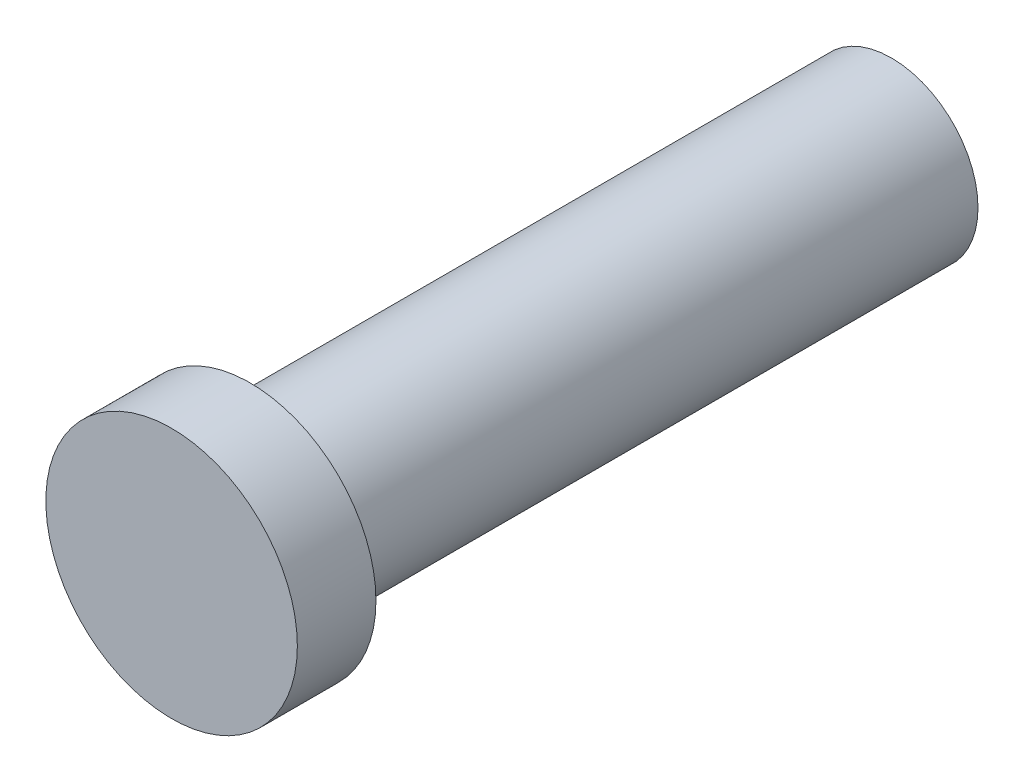
ISO-10303-21;
HEADER;
FILE_DESCRIPTION(('STEP AP214'),'2;1');
FILE_NAME('part.step','',(''),(''),'','','');
FILE_SCHEMA(('AUTOMOTIVE_DESIGN { 1 0 10303 214 1 1 1 1 }'));
ENDSEC;
DATA;
#1=APPLICATION_CONTEXT('core data for automotive mechanical design processes');
#2=APPLICATION_PROTOCOL_DEFINITION('international standard','automotive_design',2000,#1);
#3=PRODUCT_CONTEXT('',#1,'mechanical');
#4=PRODUCT('Part','Part','',(#3));
#5=PRODUCT_RELATED_PRODUCT_CATEGORY('part','',(#4));
#6=PRODUCT_DEFINITION_FORMATION('','',#4);
#7=PRODUCT_DEFINITION_CONTEXT('part definition',#1,'design');
#8=PRODUCT_DEFINITION('design','',#6,#7);
#9=PRODUCT_DEFINITION_SHAPE('','',#8);
#10=(LENGTH_UNIT() NAMED_UNIT(*) SI_UNIT(.MILLI.,.METRE.));
#11=(NAMED_UNIT(*) PLANE_ANGLE_UNIT() SI_UNIT($,.RADIAN.));
#12=(NAMED_UNIT(*) SI_UNIT($,.STERADIAN.) SOLID_ANGLE_UNIT());
#13=UNCERTAINTY_MEASURE_WITH_UNIT(LENGTH_MEASURE(1.E-05),#10,'distance_accuracy_value','');
#14=(GEOMETRIC_REPRESENTATION_CONTEXT(3) GLOBAL_UNCERTAINTY_ASSIGNED_CONTEXT((#13)) GLOBAL_UNIT_ASSIGNED_CONTEXT((#10,
#11,#12)) REPRESENTATION_CONTEXT('',''));
#15=CARTESIAN_POINT('',(0.,0.,0.));
#16=DIRECTION('',(0.,0.,1.));
#17=DIRECTION('',(1.,0.,0.));
#18=AXIS2_PLACEMENT_3D('',#15,#16,#17);
#19=CARTESIAN_POINT('',(0.,0.,40.8));
#20=DIRECTION('',(0.,0.,-1.));
#21=DIRECTION('',(-1.,0.,0.));
#22=AXIS2_PLACEMENT_3D('',#19,#20,#21);
#23=CYLINDRICAL_SURFACE('',#22,5.5);
#24=CARTESIAN_POINT('',(0.,0.,40.8));
#25=DIRECTION('',(0.,0.,1.));
#26=DIRECTION('',(1.,0.,0.));
#27=AXIS2_PLACEMENT_3D('',#24,#25,#26);
#28=CIRCLE('',#27,5.5);
#29=CARTESIAN_POINT('',(5.5,0.,40.8));
#30=VERTEX_POINT('',#29);
#31=EDGE_CURVE('E10',#30,#30,#28,.T.);
#32=ORIENTED_EDGE('',*,*,#31,.F.);
#33=EDGE_LOOP('',(#32));
#34=FACE_BOUND('',#33,.T.);
#35=CARTESIAN_POINT('',(0.,0.,0.));
#36=DIRECTION('',(0.,0.,1.));
#37=DIRECTION('',(1.,0.,0.));
#38=AXIS2_PLACEMENT_3D('',#35,#36,#37);
#39=CIRCLE('',#38,5.5);
#40=CARTESIAN_POINT('',(5.5,0.,0.));
#41=VERTEX_POINT('',#40);
#42=EDGE_CURVE('E40',#41,#41,#39,.T.);
#43=ORIENTED_EDGE('',*,*,#42,.T.);
#44=EDGE_LOOP('',(#43));
#45=FACE_BOUND('',#44,.T.);
#46=ADVANCED_FACE('F37',(#34,#45),#23,.T.);
#47=CARTESIAN_POINT('',(0.,0.,0.));
#48=DIRECTION('',(0.,0.,1.));
#49=DIRECTION('',(1.,0.,0.));
#50=AXIS2_PLACEMENT_3D('',#47,#48,#49);
#51=PLANE('',#50);
#52=CARTESIAN_POINT('',(0.,0.,0.));
#53=DIRECTION('',(0.,0.,-1.));
#54=DIRECTION('',(-1.,0.,0.));
#55=AXIS2_PLACEMENT_3D('',#52,#53,#54);
#56=CIRCLE('',#55,3.8);
#57=CARTESIAN_POINT('',(-3.8,0.,0.));
#58=VERTEX_POINT('',#57);
#59=EDGE_CURVE('E55',#58,#58,#56,.T.);
#60=ORIENTED_EDGE('',*,*,#59,.F.);
#61=EDGE_LOOP('',(#60));
#62=FACE_BOUND('',#61,.T.);
#63=ORIENTED_EDGE('',*,*,#42,.F.);
#64=EDGE_LOOP('',(#63));
#65=FACE_BOUND('',#64,.T.);
#66=ADVANCED_FACE('F70',(#62,#65),#51,.F.);
#67=CARTESIAN_POINT('',(0.,0.,45.8));
#68=DIRECTION('',(0.,0.,-1.));
#69=DIRECTION('',(-1.,0.,0.));
#70=AXIS2_PLACEMENT_3D('',#67,#68,#69);
#71=CYLINDRICAL_SURFACE('',#70,8.);
#72=CARTESIAN_POINT('',(0.,0.,45.8));
#73=DIRECTION('',(0.,0.,1.));
#74=DIRECTION('',(1.,0.,0.));
#75=AXIS2_PLACEMENT_3D('',#72,#73,#74);
#76=CIRCLE('',#75,8.);
#77=CARTESIAN_POINT('',(8.,0.,45.8));
#78=VERTEX_POINT('',#77);
#79=EDGE_CURVE('E47',#78,#78,#76,.T.);
#80=ORIENTED_EDGE('',*,*,#79,.F.);
#81=EDGE_LOOP('',(#80));
#82=FACE_BOUND('',#81,.T.);
#83=CARTESIAN_POINT('',(0.,0.,40.8));
#84=DIRECTION('',(0.,0.,1.));
#85=DIRECTION('',(1.,0.,0.));
#86=AXIS2_PLACEMENT_3D('',#83,#84,#85);
#87=CIRCLE('',#86,8.);
#88=CARTESIAN_POINT('',(8.,0.,40.8));
#89=VERTEX_POINT('',#88);
#90=EDGE_CURVE('E49',#89,#89,#87,.T.);
#91=ORIENTED_EDGE('',*,*,#90,.T.);
#92=EDGE_LOOP('',(#91));
#93=FACE_BOUND('',#92,.T.);
#94=ADVANCED_FACE('F73',(#82,#93),#71,.T.);
#95=CARTESIAN_POINT('',(0.,0.,45.8));
#96=DIRECTION('',(0.,0.,1.));
#97=DIRECTION('',(1.,0.,0.));
#98=AXIS2_PLACEMENT_3D('',#95,#96,#97);
#99=PLANE('',#98);
#100=ORIENTED_EDGE('',*,*,#79,.T.);
#101=EDGE_LOOP('',(#100));
#102=FACE_BOUND('',#101,.T.);
#103=ADVANCED_FACE('F92',(#102),#99,.T.);
#104=CARTESIAN_POINT('',(0.,0.,40.8));
#105=DIRECTION('',(0.,0.,1.));
#106=DIRECTION('',(1.,0.,0.));
#107=AXIS2_PLACEMENT_3D('',#104,#105,#106);
#108=PLANE('',#107);
#109=ORIENTED_EDGE('',*,*,#31,.T.);
#110=EDGE_LOOP('',(#109));
#111=FACE_BOUND('',#110,.T.);
#112=ORIENTED_EDGE('',*,*,#90,.F.);
#113=EDGE_LOOP('',(#112));
#114=FACE_BOUND('',#113,.T.);
#115=ADVANCED_FACE('F66',(#111,#114),#108,.F.);
#116=CARTESIAN_POINT('',(0.,0.,40.));
#117=DIRECTION('',(0.,0.,-1.));
#118=DIRECTION('',(-1.,0.,0.));
#119=AXIS2_PLACEMENT_3D('',#116,#117,#118);
#120=CYLINDRICAL_SURFACE('',#119,3.8);
#121=CARTESIAN_POINT('',(0.,0.,40.));
#122=DIRECTION('',(0.,0.,-1.));
#123=DIRECTION('',(-1.,0.,0.));
#124=AXIS2_PLACEMENT_3D('',#121,#122,#123);
#125=CIRCLE('',#124,3.8);
#126=CARTESIAN_POINT('',(-3.8,0.,40.));
#127=VERTEX_POINT('',#126);
#128=EDGE_CURVE('E52',#127,#127,#125,.T.);
#129=ORIENTED_EDGE('',*,*,#128,.F.);
#130=EDGE_LOOP('',(#129));
#131=FACE_BOUND('',#130,.T.);
#132=ORIENTED_EDGE('',*,*,#59,.T.);
#133=EDGE_LOOP('',(#132));
#134=FACE_BOUND('',#133,.T.);
#135=ADVANCED_FACE('F63',(#131,#134),#120,.F.);
#136=CARTESIAN_POINT('',(0.,0.,40.));
#137=DIRECTION('',(0.,0.,-1.));
#138=DIRECTION('',(-1.,0.,0.));
#139=AXIS2_PLACEMENT_3D('',#136,#137,#138);
#140=PLANE('',#139);
#141=ORIENTED_EDGE('',*,*,#128,.T.);
#142=EDGE_LOOP('',(#141));
#143=FACE_BOUND('',#142,.T.);
#144=ADVANCED_FACE('F61',(#143),#140,.T.);
#145=CLOSED_SHELL('',(#46,#66,#94,#103,#115,#135,#144));
#146=MANIFOLD_SOLID_BREP('B2',#145);
#147=ADVANCED_BREP_SHAPE_REPRESENTATION('',(#18,#146),#14);
#148=SHAPE_DEFINITION_REPRESENTATION(#9,#147);
ENDSEC;
END-ISO-10303-21;
